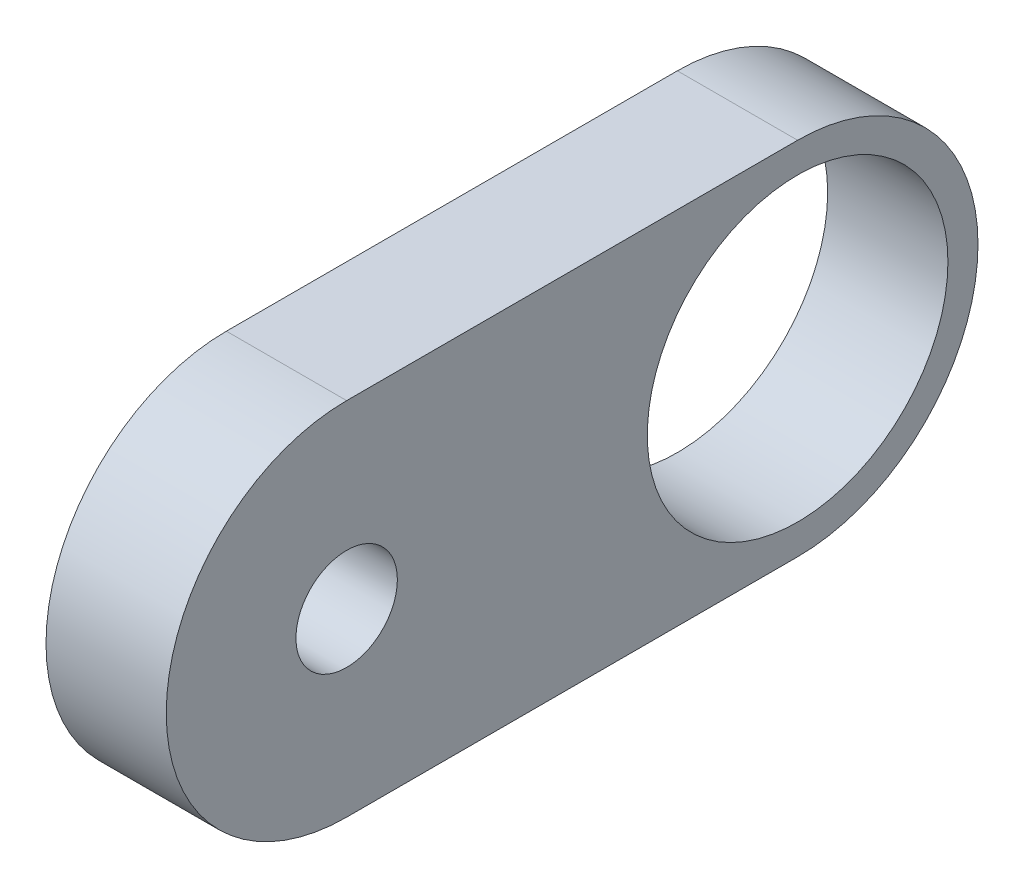
ISO-10303-21;
HEADER;
FILE_DESCRIPTION(('STEP AP214'),'2;1');
FILE_NAME('part.step','',(''),(''),'','','');
FILE_SCHEMA(('AUTOMOTIVE_DESIGN { 1 0 10303 214 1 1 1 1 }'));
ENDSEC;
DATA;
#1=APPLICATION_CONTEXT('core data for automotive mechanical design processes');
#2=APPLICATION_PROTOCOL_DEFINITION('international standard','automotive_design',2000,#1);
#3=PRODUCT_CONTEXT('',#1,'mechanical');
#4=PRODUCT('Part','Part','',(#3));
#5=PRODUCT_RELATED_PRODUCT_CATEGORY('part','',(#4));
#6=PRODUCT_DEFINITION_FORMATION('','',#4);
#7=PRODUCT_DEFINITION_CONTEXT('part definition',#1,'design');
#8=PRODUCT_DEFINITION('design','',#6,#7);
#9=PRODUCT_DEFINITION_SHAPE('','',#8);
#10=(LENGTH_UNIT() NAMED_UNIT(*) SI_UNIT(.MILLI.,.METRE.));
#11=(NAMED_UNIT(*) PLANE_ANGLE_UNIT() SI_UNIT($,.RADIAN.));
#12=(NAMED_UNIT(*) SI_UNIT($,.STERADIAN.) SOLID_ANGLE_UNIT());
#13=UNCERTAINTY_MEASURE_WITH_UNIT(LENGTH_MEASURE(1.E-05),#10,'distance_accuracy_value','');
#14=(GEOMETRIC_REPRESENTATION_CONTEXT(3) GLOBAL_UNCERTAINTY_ASSIGNED_CONTEXT((#13)) GLOBAL_UNIT_ASSIGNED_CONTEXT((#10,
#11,#12)) REPRESENTATION_CONTEXT('',''));
#15=CARTESIAN_POINT('',(0.,0.,0.));
#16=DIRECTION('',(0.,0.,1.));
#17=DIRECTION('',(1.,0.,0.));
#18=AXIS2_PLACEMENT_3D('',#15,#16,#17);
#19=CARTESIAN_POINT('',(10.1599999492,-45.6336193705345,15.3619127645357));
#20=DIRECTION('',(-1.,0.,0.));
#21=DIRECTION('',(0.,0.,1.));
#22=AXIS2_PLACEMENT_3D('',#19,#20,#21);
#23=PLANE('',#22);
#24=CARTESIAN_POINT('',(10.1599999492,-45.6336193705345,15.3619127645357));
#25=DIRECTION('',(1.,0.,0.));
#26=DIRECTION('',(0.,0.,1.));
#27=AXIS2_PLACEMENT_3D('',#24,#25,#26);
#28=CIRCLE('',#27,15.24);
#29=CARTESIAN_POINT('',(10.1599999492,-30.3936193705345,15.3619127645357));
#30=VERTEX_POINT('',#29);
#31=CARTESIAN_POINT('',(10.1599999492,-60.8736193705345,15.3619127645357));
#32=VERTEX_POINT('',#31);
#33=EDGE_CURVE('E100',#30,#32,#28,.T.);
#34=ORIENTED_EDGE('',*,*,#33,.T.);
#35=DIRECTION('',(0.,0.,-1.));
#36=VECTOR('',#35,1.);
#37=CARTESIAN_POINT('',(10.1599999492,-60.8736193705345,15.3619127645357));
#38=LINE('',#37,#36);
#39=CARTESIAN_POINT('',(10.1599999492,-60.8736193705345,-22.7380872354643));
#40=VERTEX_POINT('',#39);
#41=EDGE_CURVE('E95',#32,#40,#38,.T.);
#42=ORIENTED_EDGE('',*,*,#41,.T.);
#43=CARTESIAN_POINT('',(10.1599999492,-45.6336193705345,-22.7380872354643));
#44=DIRECTION('',(1.,0.,0.));
#45=DIRECTION('',(0.,0.,-1.));
#46=AXIS2_PLACEMENT_3D('',#43,#44,#45);
#47=CIRCLE('',#46,15.24);
#48=CARTESIAN_POINT('',(10.1599999492,-30.3936193705345,-22.7380872354643));
#49=VERTEX_POINT('',#48);
#50=EDGE_CURVE('E92',#40,#49,#47,.T.);
#51=ORIENTED_EDGE('',*,*,#50,.T.);
#52=DIRECTION('',(0.,0.,1.));
#53=VECTOR('',#52,1.);
#54=CARTESIAN_POINT('',(10.1599999492,-30.3936193705345,-22.7380872354643));
#55=LINE('',#54,#53);
#56=EDGE_CURVE('E65',#49,#30,#55,.T.);
#57=ORIENTED_EDGE('',*,*,#56,.T.);
#58=EDGE_LOOP('',(#34,#42,#51,#57));
#59=FACE_BOUND('',#58,.T.);
#60=CARTESIAN_POINT('',(10.1599999492,-45.6336193705345,-22.7380872354643));
#61=DIRECTION('',(1.,0.,0.));
#62=DIRECTION('',(0.,0.,-1.));
#63=AXIS2_PLACEMENT_3D('',#60,#61,#62);
#64=CIRCLE('',#63,12.7);
#65=CARTESIAN_POINT('',(10.1599999492,-45.6336193705345,-35.4380872354643));
#66=VERTEX_POINT('',#65);
#67=EDGE_CURVE('E115',#66,#66,#64,.T.);
#68=ORIENTED_EDGE('',*,*,#67,.F.);
#69=EDGE_LOOP('',(#68));
#70=FACE_BOUND('',#69,.T.);
#71=CARTESIAN_POINT('',(10.1599999492,-45.6336193705345,15.3619127645357));
#72=DIRECTION('',(1.,0.,0.));
#73=DIRECTION('',(0.,0.,-1.));
#74=AXIS2_PLACEMENT_3D('',#71,#72,#73);
#75=CIRCLE('',#74,4.28498);
#76=CARTESIAN_POINT('',(10.1599999492,-45.6336193705345,11.0769327645357));
#77=VERTEX_POINT('',#76);
#78=EDGE_CURVE('E130',#77,#77,#75,.T.);
#79=ORIENTED_EDGE('',*,*,#78,.F.);
#80=EDGE_LOOP('',(#79));
#81=FACE_BOUND('',#80,.T.);
#82=ADVANCED_FACE('F44',(#59,#70,#81),#23,.F.);
#83=CARTESIAN_POINT('',(0.,-45.6336193705345,15.3619127645357));
#84=DIRECTION('',(-1.,0.,0.));
#85=DIRECTION('',(0.,0.,1.));
#86=AXIS2_PLACEMENT_3D('',#83,#84,#85);
#87=PLANE('',#86);
#88=CARTESIAN_POINT('',(0.,-45.6336193705345,-22.7380872354643));
#89=DIRECTION('',(1.,0.,0.));
#90=DIRECTION('',(0.,0.,-1.));
#91=AXIS2_PLACEMENT_3D('',#88,#89,#90);
#92=CIRCLE('',#91,12.7);
#93=CARTESIAN_POINT('',(0.,-45.6336193705345,-35.4380872354643));
#94=VERTEX_POINT('',#93);
#95=EDGE_CURVE('E121',#94,#94,#92,.T.);
#96=ORIENTED_EDGE('',*,*,#95,.T.);
#97=EDGE_LOOP('',(#96));
#98=FACE_BOUND('',#97,.T.);
#99=CARTESIAN_POINT('',(0.,-45.6336193705345,15.3619127645357));
#100=DIRECTION('',(1.,0.,0.));
#101=DIRECTION('',(0.,0.,1.));
#102=AXIS2_PLACEMENT_3D('',#99,#100,#101);
#103=CIRCLE('',#102,15.24);
#104=CARTESIAN_POINT('',(0.,-30.3936193705345,15.3619127645357));
#105=VERTEX_POINT('',#104);
#106=CARTESIAN_POINT('',(0.,-60.8736193705345,15.3619127645357));
#107=VERTEX_POINT('',#106);
#108=EDGE_CURVE('E108',#105,#107,#103,.T.);
#109=ORIENTED_EDGE('',*,*,#108,.F.);
#110=DIRECTION('',(0.,0.,1.));
#111=VECTOR('',#110,1.);
#112=CARTESIAN_POINT('',(0.,-30.3936193705345,-22.7380872354643));
#113=LINE('',#112,#111);
#114=CARTESIAN_POINT('',(0.,-30.3936193705345,-22.7380872354643));
#115=VERTEX_POINT('',#114);
#116=EDGE_CURVE('E83',#115,#105,#113,.T.);
#117=ORIENTED_EDGE('',*,*,#116,.F.);
#118=CARTESIAN_POINT('',(0.,-45.6336193705345,-22.7380872354643));
#119=DIRECTION('',(1.,0.,0.));
#120=DIRECTION('',(0.,0.,-1.));
#121=AXIS2_PLACEMENT_3D('',#118,#119,#120);
#122=CIRCLE('',#121,15.24);
#123=CARTESIAN_POINT('',(0.,-60.8736193705345,-22.7380872354643));
#124=VERTEX_POINT('',#123);
#125=EDGE_CURVE('E76',#124,#115,#122,.T.);
#126=ORIENTED_EDGE('',*,*,#125,.F.);
#127=DIRECTION('',(0.,0.,-1.));
#128=VECTOR('',#127,1.);
#129=CARTESIAN_POINT('',(0.,-60.8736193705345,15.3619127645357));
#130=LINE('',#129,#128);
#131=EDGE_CURVE('E101',#107,#124,#130,.T.);
#132=ORIENTED_EDGE('',*,*,#131,.F.);
#133=EDGE_LOOP('',(#109,#117,#126,#132));
#134=FACE_BOUND('',#133,.T.);
#135=CARTESIAN_POINT('',(0.,-45.6336193705345,15.3619127645357));
#136=DIRECTION('',(1.,0.,0.));
#137=DIRECTION('',(0.,0.,-1.));
#138=AXIS2_PLACEMENT_3D('',#135,#136,#137);
#139=CIRCLE('',#138,4.28498);
#140=CARTESIAN_POINT('',(0.,-45.6336193705345,11.0769327645357));
#141=VERTEX_POINT('',#140);
#142=EDGE_CURVE('E128',#141,#141,#139,.T.);
#143=ORIENTED_EDGE('',*,*,#142,.T.);
#144=EDGE_LOOP('',(#143));
#145=FACE_BOUND('',#144,.T.);
#146=ADVANCED_FACE('F118',(#98,#134,#145),#87,.T.);
#147=CARTESIAN_POINT('',(10.1599999492,-45.6336193705345,15.3619127645357));
#148=DIRECTION('',(-1.,0.,0.));
#149=DIRECTION('',(0.,0.,1.));
#150=AXIS2_PLACEMENT_3D('',#147,#148,#149);
#151=CYLINDRICAL_SURFACE('',#150,15.24);
#152=ORIENTED_EDGE('',*,*,#108,.T.);
#153=DIRECTION('',(-1.,0.,0.));
#154=VECTOR('',#153,1.);
#155=CARTESIAN_POINT('',(10.1599999492,-60.8736193705345,15.3619127645357));
#156=LINE('',#155,#154);
#157=EDGE_CURVE('E11',#32,#107,#156,.T.);
#158=ORIENTED_EDGE('',*,*,#157,.F.);
#159=ORIENTED_EDGE('',*,*,#33,.F.);
#160=DIRECTION('',(-1.,0.,0.));
#161=VECTOR('',#160,1.);
#162=CARTESIAN_POINT('',(10.1599999492,-30.3936193705345,15.3619127645357));
#163=LINE('',#162,#161);
#164=EDGE_CURVE('E104',#30,#105,#163,.T.);
#165=ORIENTED_EDGE('',*,*,#164,.T.);
#166=EDGE_LOOP('',(#152,#158,#159,#165));
#167=FACE_BOUND('',#166,.T.);
#168=ADVANCED_FACE('F50',(#167),#151,.T.);
#169=CARTESIAN_POINT('',(10.1599999492,-60.8736193705345,15.3619127645357));
#170=DIRECTION('',(0.,1.,0.));
#171=DIRECTION('',(0.,0.,1.));
#172=AXIS2_PLACEMENT_3D('',#169,#170,#171);
#173=PLANE('',#172);
#174=ORIENTED_EDGE('',*,*,#131,.T.);
#175=DIRECTION('',(-1.,0.,0.));
#176=VECTOR('',#175,1.);
#177=CARTESIAN_POINT('',(10.1599999492,-60.8736193705345,-22.7380872354643));
#178=LINE('',#177,#176);
#179=EDGE_CURVE('E53',#40,#124,#178,.T.);
#180=ORIENTED_EDGE('',*,*,#179,.F.);
#181=ORIENTED_EDGE('',*,*,#41,.F.);
#182=ORIENTED_EDGE('',*,*,#157,.T.);
#183=EDGE_LOOP('',(#174,#180,#181,#182));
#184=FACE_BOUND('',#183,.T.);
#185=ADVANCED_FACE('F99',(#184),#173,.F.);
#186=CARTESIAN_POINT('',(10.1599999492,-45.6336193705345,-22.7380872354643));
#187=DIRECTION('',(-1.,0.,0.));
#188=DIRECTION('',(0.,0.,1.));
#189=AXIS2_PLACEMENT_3D('',#186,#187,#188);
#190=CYLINDRICAL_SURFACE('',#189,15.24);
#191=ORIENTED_EDGE('',*,*,#125,.T.);
#192=DIRECTION('',(-1.,0.,0.));
#193=VECTOR('',#192,1.);
#194=CARTESIAN_POINT('',(10.1599999492,-30.3936193705345,-22.7380872354643));
#195=LINE('',#194,#193);
#196=EDGE_CURVE('E105',#49,#115,#195,.T.);
#197=ORIENTED_EDGE('',*,*,#196,.F.);
#198=ORIENTED_EDGE('',*,*,#50,.F.);
#199=ORIENTED_EDGE('',*,*,#179,.T.);
#200=EDGE_LOOP('',(#191,#197,#198,#199));
#201=FACE_BOUND('',#200,.T.);
#202=ADVANCED_FACE('F103',(#201),#190,.T.);
#203=CARTESIAN_POINT('',(10.1599999492,-30.3936193705345,-22.7380872354643));
#204=DIRECTION('',(0.,-1.,0.));
#205=DIRECTION('',(0.,0.,-1.));
#206=AXIS2_PLACEMENT_3D('',#203,#204,#205);
#207=PLANE('',#206);
#208=ORIENTED_EDGE('',*,*,#116,.T.);
#209=ORIENTED_EDGE('',*,*,#164,.F.);
#210=ORIENTED_EDGE('',*,*,#56,.F.);
#211=ORIENTED_EDGE('',*,*,#196,.T.);
#212=EDGE_LOOP('',(#208,#209,#210,#211));
#213=FACE_BOUND('',#212,.T.);
#214=ADVANCED_FACE('F120',(#213),#207,.F.);
#215=CARTESIAN_POINT('',(10.1599999492,-45.6336193705345,-22.7380872354643));
#216=DIRECTION('',(-1.,0.,0.));
#217=DIRECTION('',(0.,0.,1.));
#218=AXIS2_PLACEMENT_3D('',#215,#216,#217);
#219=CYLINDRICAL_SURFACE('',#218,12.7);
#220=ORIENTED_EDGE('',*,*,#67,.T.);
#221=EDGE_LOOP('',(#220));
#222=FACE_BOUND('',#221,.T.);
#223=ORIENTED_EDGE('',*,*,#95,.F.);
#224=EDGE_LOOP('',(#223));
#225=FACE_BOUND('',#224,.T.);
#226=ADVANCED_FACE('F150',(#222,#225),#219,.F.);
#227=CARTESIAN_POINT('',(10.1599999492,-45.6336193705345,15.3619127645357));
#228=DIRECTION('',(-1.,0.,0.));
#229=DIRECTION('',(0.,0.,1.));
#230=AXIS2_PLACEMENT_3D('',#227,#228,#229);
#231=CYLINDRICAL_SURFACE('',#230,4.28498);
#232=ORIENTED_EDGE('',*,*,#78,.T.);
#233=EDGE_LOOP('',(#232));
#234=FACE_BOUND('',#233,.T.);
#235=ORIENTED_EDGE('',*,*,#142,.F.);
#236=EDGE_LOOP('',(#235));
#237=FACE_BOUND('',#236,.T.);
#238=ADVANCED_FACE('F137',(#234,#237),#231,.F.);
#239=CLOSED_SHELL('',(#82,#146,#168,#185,#202,#214,#226,#238));
#240=MANIFOLD_SOLID_BREP('B2',#239);
#241=ADVANCED_BREP_SHAPE_REPRESENTATION('',(#18,#240),#14);
#242=SHAPE_DEFINITION_REPRESENTATION(#9,#241);
ENDSEC;
END-ISO-10303-21;
